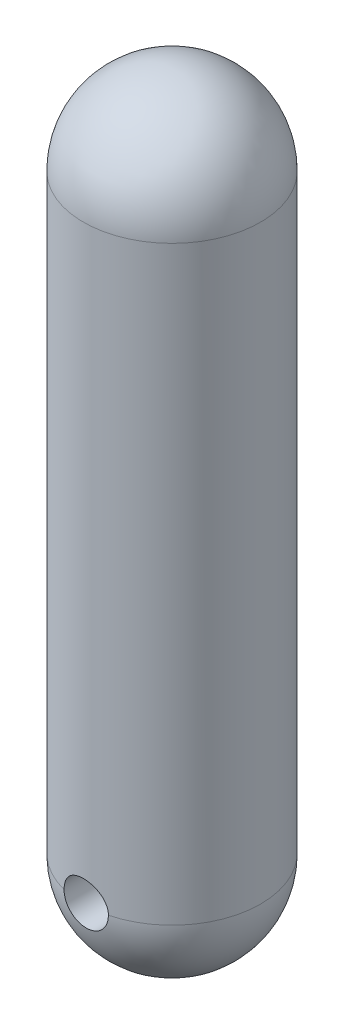
ISO-10303-21;
HEADER;
FILE_DESCRIPTION(('STEP AP214'),'2;1');
FILE_NAME('part.step','',(''),(''),'','','');
FILE_SCHEMA(('AUTOMOTIVE_DESIGN { 1 0 10303 214 1 1 1 1 }'));
ENDSEC;
DATA;
#1=APPLICATION_CONTEXT('core data for automotive mechanical design processes');
#2=APPLICATION_PROTOCOL_DEFINITION('international standard','automotive_design',2000,#1);
#3=PRODUCT_CONTEXT('',#1,'mechanical');
#4=PRODUCT('Part','Part','',(#3));
#5=PRODUCT_RELATED_PRODUCT_CATEGORY('part','',(#4));
#6=PRODUCT_DEFINITION_FORMATION('','',#4);
#7=PRODUCT_DEFINITION_CONTEXT('part definition',#1,'design');
#8=PRODUCT_DEFINITION('design','',#6,#7);
#9=PRODUCT_DEFINITION_SHAPE('','',#8);
#10=(LENGTH_UNIT() NAMED_UNIT(*) SI_UNIT(.MILLI.,.METRE.));
#11=(NAMED_UNIT(*) PLANE_ANGLE_UNIT() SI_UNIT($,.RADIAN.));
#12=(NAMED_UNIT(*) SI_UNIT($,.STERADIAN.) SOLID_ANGLE_UNIT());
#13=UNCERTAINTY_MEASURE_WITH_UNIT(LENGTH_MEASURE(1.E-05),#10,'distance_accuracy_value','');
#14=(GEOMETRIC_REPRESENTATION_CONTEXT(3) GLOBAL_UNCERTAINTY_ASSIGNED_CONTEXT((#13)) GLOBAL_UNIT_ASSIGNED_CONTEXT((#10,
#11,#12)) REPRESENTATION_CONTEXT('',''));
#15=CARTESIAN_POINT('',(0.,0.,0.));
#16=DIRECTION('',(0.,0.,1.));
#17=DIRECTION('',(1.,0.,0.));
#18=AXIS2_PLACEMENT_3D('',#15,#16,#17);
#19=CARTESIAN_POINT('',(0.,0.,0.));
#20=DIRECTION('',(0.,-1.,0.));
#21=DIRECTION('',(0.,0.,-1.));
#22=AXIS2_PLACEMENT_3D('',#19,#20,#21);
#23=CYLINDRICAL_SURFACE('',#22,15.);
#24=CARTESIAN_POINT('',(0.,0.,0.));
#25=DIRECTION('',(0.,-1.,0.));
#26=DIRECTION('',(0.,0.,-1.));
#27=AXIS2_PLACEMENT_3D('',#24,#25,#26);
#28=CIRCLE('',#27,15.);
#29=CARTESIAN_POINT('',(3.74999999999999,0.,-14.5236875482778));
#30=VERTEX_POINT('',#29);
#31=CARTESIAN_POINT('',(3.74999999999999,0.,14.5236875482778));
#32=VERTEX_POINT('',#31);
#33=EDGE_CURVE('E81',#30,#32,#28,.T.);
#34=ORIENTED_EDGE('',*,*,#33,.F.);
#35=CARTESIAN_POINT('',(3.75,0.,-14.5236875482778));
#36=CARTESIAN_POINT('',(3.75001201403416,0.103706677724471,-14.5236759616076));
#37=CARTESIAN_POINT('',(3.74569815141733,0.20740622934752,-14.5247980682246));
#38=CARTESIAN_POINT('',(3.72851198487854,0.414029886876262,-14.5292237335387));
#39=CARTESIAN_POINT('',(3.71564112109048,0.51695412031984,-14.5325269251611));
#40=CARTESIAN_POINT('',(3.68146799506696,0.721099497149315,-14.5412202841226));
#41=CARTESIAN_POINT('',(3.66018243978515,0.822323603393321,-14.5466063156273));
#42=CARTESIAN_POINT('',(3.6093776100614,1.02253321546534,-14.5592950909212));
#43=CARTESIAN_POINT('',(3.57985822238909,1.12151869048781,-14.5665978610689));
#44=CARTESIAN_POINT('',(3.47927324292647,1.41406512164404,-14.5910755493876));
#45=CARTESIAN_POINT('',(3.39614618760971,1.60342117476411,-14.6108292234463));
#46=CARTESIAN_POINT('',(3.20029949813495,1.96545881192879,-14.6549682931127));
#47=CARTESIAN_POINT('',(3.08757192870085,2.13813590769059,-14.679354930235));
#48=CARTESIAN_POINT('',(2.8330690217427,2.46577828637881,-14.730609633032));
#49=CARTESIAN_POINT('',(2.6907653618085,2.62032780187402,-14.7575171081218));
#50=CARTESIAN_POINT('',(2.38228357297083,2.90363585758937,-14.8104414703287));
#51=CARTESIAN_POINT('',(2.21610163509949,3.03239027521772,-14.8364582145386));
#52=CARTESIAN_POINT('',(1.86171353797471,3.26216542999599,-14.88510682047));
#53=CARTESIAN_POINT('',(1.67323257080884,3.36277438950531,-14.9076864215641));
#54=CARTESIAN_POINT('',(1.28138467111515,3.53071797362885,-14.946462988397));
#55=CARTESIAN_POINT('',(1.07802067729895,3.59805914685373,-14.9626612101537));
#56=CARTESIAN_POINT('',(0.666540419718242,3.69622116831426,-14.9865712493572));
#57=CARTESIAN_POINT('',(0.458603715229691,3.72775376694981,-14.9944482343318));
#58=CARTESIAN_POINT('',(0.0402479010882837,3.75563764792255,-15.0014039301226));
#59=CARTESIAN_POINT('',(-0.170170893232058,3.75199335217347,-15.0004837467876));
#60=CARTESIAN_POINT('',(-0.582571830923246,3.71013767142724,-14.9900714041158));
#61=CARTESIAN_POINT('',(-0.7846375688019,3.67269533160969,-14.9807699613657));
#62=CARTESIAN_POINT('',(-1.17952022929162,3.5655423092006,-14.9548623879035));
#63=CARTESIAN_POINT('',(-1.37233674227317,3.4958301988995,-14.9382559339978));
#64=CARTESIAN_POINT('',(-1.74527708729809,3.32549574259334,-14.8993124573987));
#65=CARTESIAN_POINT('',(-1.92527022943906,3.22459931544802,-14.8769249234421));
#66=CARTESIAN_POINT('',(-2.26603824881482,2.99496121899525,-14.8288478028898));
#67=CARTESIAN_POINT('',(-2.42681022506857,2.8662153546898,-14.8031577190633));
#68=CARTESIAN_POINT('',(-2.72913183095141,2.5804619173129,-14.7504593198838));
#69=CARTESIAN_POINT('',(-2.87004636224014,2.42278598022019,-14.7234341376498));
#70=CARTESIAN_POINT('',(-3.12364868465331,2.08560837368006,-14.6717290653));
#71=CARTESIAN_POINT('',(-3.23632874892082,1.90610074952909,-14.6470498183349));
#72=CARTESIAN_POINT('',(-3.3818590927831,1.62384527829105,-14.6138807093137));
#73=CARTESIAN_POINT('',(-3.42656007812527,1.5272616037802,-14.6034385687105));
#74=CARTESIAN_POINT('',(-3.50763755967466,1.33051780257088,-14.5841770091006));
#75=CARTESIAN_POINT('',(-3.54401737813212,1.23035912173334,-14.5753569427526));
#76=CARTESIAN_POINT('',(-3.60811814060867,1.02728511978684,-14.5596213054031));
#77=CARTESIAN_POINT('',(-3.63584805049469,0.92437277391054,-14.5527037632692));
#78=CARTESIAN_POINT('',(-3.68245660419231,0.716485838794866,-14.5409796918035));
#79=CARTESIAN_POINT('',(-3.70133939474104,0.611512239773967,-14.5361721735484));
#80=CARTESIAN_POINT('',(-3.72713404506219,0.422056799044119,-14.5295772481194));
#81=CARTESIAN_POINT('',(-3.7357113011292,0.337812092499016,-14.5273715376381));
#82=CARTESIAN_POINT('',(-3.74714199960014,0.169047326163004,-14.5244254217604));
#83=CARTESIAN_POINT('',(-3.75000470259002,0.0845279345489204,-14.5236826456659));
#84=CARTESIAN_POINT('',(-3.75,0.,-14.5236875482778));
#85=B_SPLINE_CURVE_WITH_KNOTS('',3,(#35,#36,#37,#38,#39,#40,#41,#42,#43,#44,#45,#46,#47,#48,#49,
#50,#51,#52,#53,#54,#55,#56,#57,#58,#59,#60,#61,#62,#63,#64,#65,#66,#67,#68,#69,#70,#71,#72,#73,
#74,#75,#76,#77,#78,#79,#80,#81,#82,#83,#84),.UNSPECIFIED.,.F.,.F.,(4,2,2,2,2,2,2,2,2,2,2,2,2,2,
2,2,2,2,2,2,2,2,2,2,4),(0.,0.311011988774136,0.621971647817443,0.932316987863798,
1.24266659594123,1.86274904223316,2.48299788961535,3.11546134974494,3.74802581016201,
4.38941125057384,5.03067038685596,5.65894729121472,6.28714521901399,6.90139968986287,
7.51568133973396,8.13552333877915,8.75545877055236,9.39210784193537,10.0289309536763,
10.3494172656964,10.6697753983969,10.989800359164,11.3096751704642,11.5636027148299,
11.8171184276844),.UNSPECIFIED.);
#86=CARTESIAN_POINT('',(-3.74999999999999,0.,-14.5236875482778));
#87=VERTEX_POINT('',#86);
#88=EDGE_CURVE('E69',#30,#87,#85,.T.);
#89=ORIENTED_EDGE('',*,*,#88,.T.);
#90=CARTESIAN_POINT('',(-3.74999999999999,0.,14.5236875482778));
#91=VERTEX_POINT('',#90);
#92=EDGE_CURVE('E79',#91,#87,#28,.T.);
#93=ORIENTED_EDGE('',*,*,#92,.F.);
#94=CARTESIAN_POINT('',(-3.75,0.,14.5236875482778));
#95=CARTESIAN_POINT('',(-3.75001201403416,0.103706677724471,14.5236759616076));
#96=CARTESIAN_POINT('',(-3.74569815141733,0.20740622934752,14.5247980682246));
#97=CARTESIAN_POINT('',(-3.72851198487854,0.414029886876262,14.5292237335387));
#98=CARTESIAN_POINT('',(-3.71564112109048,0.51695412031984,14.5325269251611));
#99=CARTESIAN_POINT('',(-3.68146799506696,0.721099497149315,14.5412202841226));
#100=CARTESIAN_POINT('',(-3.66018243978515,0.822323603393321,14.5466063156273));
#101=CARTESIAN_POINT('',(-3.6093776100614,1.02253321546534,14.5592950909212));
#102=CARTESIAN_POINT('',(-3.57985822238909,1.12151869048781,14.5665978610689));
#103=CARTESIAN_POINT('',(-3.47927324292647,1.41406512164404,14.5910755493876));
#104=CARTESIAN_POINT('',(-3.39614618760971,1.60342117476411,14.6108292234463));
#105=CARTESIAN_POINT('',(-3.20029949813495,1.96545881192879,14.6549682931127));
#106=CARTESIAN_POINT('',(-3.08757192870085,2.13813590769059,14.679354930235));
#107=CARTESIAN_POINT('',(-2.8330690217427,2.46577828637881,14.730609633032));
#108=CARTESIAN_POINT('',(-2.6907653618085,2.62032780187402,14.7575171081218));
#109=CARTESIAN_POINT('',(-2.38228357297083,2.90363585758937,14.8104414703287));
#110=CARTESIAN_POINT('',(-2.21610163509949,3.03239027521772,14.8364582145386));
#111=CARTESIAN_POINT('',(-1.86171353797471,3.26216542999599,14.88510682047));
#112=CARTESIAN_POINT('',(-1.67323257080884,3.36277438950531,14.9076864215641));
#113=CARTESIAN_POINT('',(-1.28138467111515,3.53071797362885,14.946462988397));
#114=CARTESIAN_POINT('',(-1.07802067729895,3.59805914685373,14.9626612101537));
#115=CARTESIAN_POINT('',(-0.666540419718242,3.69622116831426,14.9865712493572));
#116=CARTESIAN_POINT('',(-0.458603715229691,3.72775376694981,14.9944482343318));
#117=CARTESIAN_POINT('',(-0.0402479010882837,3.75563764792255,15.0014039301226));
#118=CARTESIAN_POINT('',(0.170170893232058,3.75199335217347,15.0004837467876));
#119=CARTESIAN_POINT('',(0.582571830923246,3.71013767142724,14.9900714041158));
#120=CARTESIAN_POINT('',(0.7846375688019,3.67269533160969,14.9807699613657));
#121=CARTESIAN_POINT('',(1.17952022929162,3.5655423092006,14.9548623879035));
#122=CARTESIAN_POINT('',(1.37233674227317,3.4958301988995,14.9382559339978));
#123=CARTESIAN_POINT('',(1.74527708729809,3.32549574259334,14.8993124573987));
#124=CARTESIAN_POINT('',(1.92527022943906,3.22459931544802,14.8769249234421));
#125=CARTESIAN_POINT('',(2.26603824881482,2.99496121899525,14.8288478028898));
#126=CARTESIAN_POINT('',(2.42681022506857,2.8662153546898,14.8031577190633));
#127=CARTESIAN_POINT('',(2.72913183095141,2.5804619173129,14.7504593198838));
#128=CARTESIAN_POINT('',(2.87004636224014,2.42278598022019,14.7234341376498));
#129=CARTESIAN_POINT('',(3.12364868465331,2.08560837368006,14.6717290653));
#130=CARTESIAN_POINT('',(3.23632874892082,1.90610074952909,14.6470498183349));
#131=CARTESIAN_POINT('',(3.3818590927831,1.62384527829105,14.6138807093137));
#132=CARTESIAN_POINT('',(3.42656007812527,1.5272616037802,14.6034385687105));
#133=CARTESIAN_POINT('',(3.50763755967466,1.33051780257088,14.5841770091006));
#134=CARTESIAN_POINT('',(3.54401737813212,1.23035912173334,14.5753569427526));
#135=CARTESIAN_POINT('',(3.60811814060867,1.02728511978684,14.5596213054031));
#136=CARTESIAN_POINT('',(3.63584805049469,0.92437277391054,14.5527037632692));
#137=CARTESIAN_POINT('',(3.68245660419231,0.716485838794866,14.5409796918035));
#138=CARTESIAN_POINT('',(3.70133939474104,0.611512239773967,14.5361721735484));
#139=CARTESIAN_POINT('',(3.72713404506219,0.422056799044119,14.5295772481194));
#140=CARTESIAN_POINT('',(3.7357113011292,0.337812092499016,14.5273715376381));
#141=CARTESIAN_POINT('',(3.74714199960014,0.169047326163004,14.5244254217604));
#142=CARTESIAN_POINT('',(3.75000470259002,0.0845279345489204,14.5236826456659));
#143=CARTESIAN_POINT('',(3.75,0.,14.5236875482778));
#144=B_SPLINE_CURVE_WITH_KNOTS('',3,(#94,#95,#96,#97,#98,#99,#100,#101,#102,#103,#104,#105,#106,
#107,#108,#109,#110,#111,#112,#113,#114,#115,#116,#117,#118,#119,#120,#121,#122,#123,#124,#125,
#126,#127,#128,#129,#130,#131,#132,#133,#134,#135,#136,#137,#138,#139,#140,#141,#142,#143),
.UNSPECIFIED.,.F.,.F.,(4,2,2,2,2,2,2,2,2,2,2,2,2,2,2,2,2,2,2,2,2,2,2,2,4),(0.,0.311011988774136,
0.621971647817443,0.932316987863798,1.24266659594123,1.86274904223316,2.48299788961535,
3.11546134974494,3.74802581016201,4.38941125057384,5.03067038685596,5.65894729121472,
6.28714521901399,6.90139968986287,7.51568133973396,8.13552333877915,8.75545877055236,
9.39210784193537,10.0289309536763,10.3494172656964,10.6697753983969,10.989800359164,
11.3096751704642,11.5636027148299,11.8171184276844),.UNSPECIFIED.);
#145=EDGE_CURVE('E63',#91,#32,#144,.T.);
#146=ORIENTED_EDGE('',*,*,#145,.T.);
#147=EDGE_LOOP('',(#34,#89,#93,#146));
#148=FACE_BOUND('',#147,.T.);
#149=CARTESIAN_POINT('',(0.,100.,0.));
#150=DIRECTION('',(0.,-1.,0.));
#151=DIRECTION('',(0.,0.,-1.));
#152=AXIS2_PLACEMENT_3D('',#149,#150,#151);
#153=CIRCLE('',#152,15.);
#154=CARTESIAN_POINT('',(0.,100.,-15.));
#155=VERTEX_POINT('',#154);
#156=EDGE_CURVE('E86',#155,#155,#153,.T.);
#157=ORIENTED_EDGE('',*,*,#156,.T.);
#158=EDGE_LOOP('',(#157));
#159=FACE_BOUND('',#158,.T.);
#160=ADVANCED_FACE('F49',(#148,#159),#23,.T.);
#161=CARTESIAN_POINT('',(0.,0.,0.));
#162=DIRECTION('',(0.,-1.,0.));
#163=DIRECTION('',(-1.,0.,0.));
#164=AXIS2_PLACEMENT_3D('',#161,#162,#163);
#165=SPHERICAL_SURFACE('',#164,15.);
#166=ORIENTED_EDGE('',*,*,#33,.T.);
#167=CARTESIAN_POINT('',(0.,0.,14.5236875482778));
#168=DIRECTION('',(0.,0.,-1.));
#169=DIRECTION('',(-1.,0.,0.));
#170=AXIS2_PLACEMENT_3D('',#167,#168,#169);
#171=CIRCLE('',#170,3.75);
#172=EDGE_CURVE('E13',#32,#91,#171,.T.);
#173=ORIENTED_EDGE('',*,*,#172,.T.);
#174=ORIENTED_EDGE('',*,*,#92,.T.);
#175=CARTESIAN_POINT('',(0.,0.,-14.5236875482778));
#176=DIRECTION('',(0.,0.,1.));
#177=DIRECTION('',(1.,0.,0.));
#178=AXIS2_PLACEMENT_3D('',#175,#176,#177);
#179=CIRCLE('',#178,3.75);
#180=EDGE_CURVE('E57',#87,#30,#179,.T.);
#181=ORIENTED_EDGE('',*,*,#180,.T.);
#182=EDGE_LOOP('',(#166,#173,#174,#181));
#183=FACE_BOUND('',#182,.T.);
#184=ADVANCED_FACE('F85',(#183),#165,.T.);
#185=CARTESIAN_POINT('',(0.,100.,0.));
#186=DIRECTION('',(0.,-1.,0.));
#187=DIRECTION('',(-1.,0.,0.));
#188=AXIS2_PLACEMENT_3D('',#185,#186,#187);
#189=SPHERICAL_SURFACE('',#188,15.);
#190=ORIENTED_EDGE('',*,*,#156,.F.);
#191=EDGE_LOOP('',(#190));
#192=FACE_BOUND('',#191,.T.);
#193=ADVANCED_FACE('F103',(#192),#189,.T.);
#194=CARTESIAN_POINT('',(0.,0.,-15.));
#195=DIRECTION('',(0.,0.,1.));
#196=DIRECTION('',(1.,0.,0.));
#197=AXIS2_PLACEMENT_3D('',#194,#195,#196);
#198=CYLINDRICAL_SURFACE('',#197,3.75);
#199=ORIENTED_EDGE('',*,*,#180,.F.);
#200=ORIENTED_EDGE('',*,*,#88,.F.);
#201=EDGE_LOOP('',(#199,#200));
#202=FACE_BOUND('',#201,.T.);
#203=ORIENTED_EDGE('',*,*,#172,.F.);
#204=ORIENTED_EDGE('',*,*,#145,.F.);
#205=EDGE_LOOP('',(#203,#204));
#206=FACE_BOUND('',#205,.T.);
#207=ADVANCED_FACE('F83',(#202,#206),#198,.F.);
#208=CLOSED_SHELL('',(#160,#184,#193,#207));
#209=MANIFOLD_SOLID_BREP('B2',#208);
#210=ADVANCED_BREP_SHAPE_REPRESENTATION('',(#18,#209),#14);
#211=SHAPE_DEFINITION_REPRESENTATION(#9,#210);
ENDSEC;
END-ISO-10303-21;
